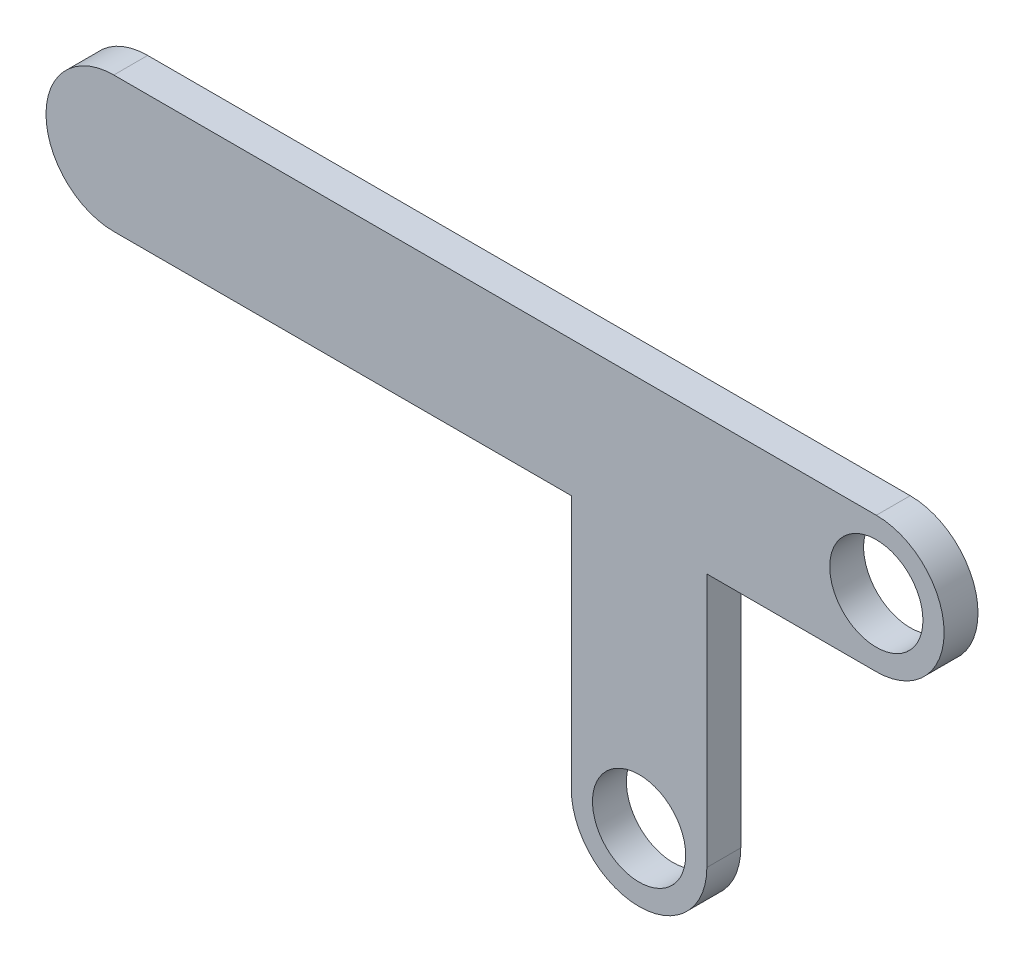
ISO-10303-21;
HEADER;
FILE_DESCRIPTION(('STEP AP214'),'2;1');
FILE_NAME('part.step','',(''),(''),'','','');
FILE_SCHEMA(('AUTOMOTIVE_DESIGN { 1 0 10303 214 1 1 1 1 }'));
ENDSEC;
DATA;
#1=APPLICATION_CONTEXT('core data for automotive mechanical design processes');
#2=APPLICATION_PROTOCOL_DEFINITION('international standard','automotive_design',2000,#1);
#3=PRODUCT_CONTEXT('',#1,'mechanical');
#4=PRODUCT('Part','Part','',(#3));
#5=PRODUCT_RELATED_PRODUCT_CATEGORY('part','',(#4));
#6=PRODUCT_DEFINITION_FORMATION('','',#4);
#7=PRODUCT_DEFINITION_CONTEXT('part definition',#1,'design');
#8=PRODUCT_DEFINITION('design','',#6,#7);
#9=PRODUCT_DEFINITION_SHAPE('','',#8);
#10=(LENGTH_UNIT() NAMED_UNIT(*) SI_UNIT(.MILLI.,.METRE.));
#11=(NAMED_UNIT(*) PLANE_ANGLE_UNIT() SI_UNIT($,.RADIAN.));
#12=(NAMED_UNIT(*) SI_UNIT($,.STERADIAN.) SOLID_ANGLE_UNIT());
#13=UNCERTAINTY_MEASURE_WITH_UNIT(LENGTH_MEASURE(1.E-05),#10,'distance_accuracy_value','');
#14=(GEOMETRIC_REPRESENTATION_CONTEXT(3) GLOBAL_UNCERTAINTY_ASSIGNED_CONTEXT((#13)) GLOBAL_UNIT_ASSIGNED_CONTEXT((#10,
#11,#12)) REPRESENTATION_CONTEXT('',''));
#15=CARTESIAN_POINT('',(0.,0.,0.));
#16=DIRECTION('',(0.,0.,1.));
#17=DIRECTION('',(1.,0.,0.));
#18=AXIS2_PLACEMENT_3D('',#15,#16,#17);
#19=CARTESIAN_POINT('',(0.,4.,2.));
#20=DIRECTION('',(0.,0.,1.));
#21=DIRECTION('',(1.,0.,0.));
#22=AXIS2_PLACEMENT_3D('',#19,#20,#21);
#23=PLANE('',#22);
#24=CARTESIAN_POINT('',(45.,4.,2.));
#25=DIRECTION('',(0.,0.,1.));
#26=DIRECTION('',(1.,0.,0.));
#27=AXIS2_PLACEMENT_3D('',#24,#25,#26);
#28=CIRCLE('',#27,2.75);
#29=CARTESIAN_POINT('',(47.75,4.,2.));
#30=VERTEX_POINT('',#29);
#31=EDGE_CURVE('E144',#30,#30,#28,.T.);
#32=ORIENTED_EDGE('',*,*,#31,.F.);
#33=EDGE_LOOP('',(#32));
#34=FACE_BOUND('',#33,.T.);
#35=CARTESIAN_POINT('',(0.,4.,2.));
#36=DIRECTION('',(0.,0.,1.));
#37=DIRECTION('',(1.,0.,0.));
#38=AXIS2_PLACEMENT_3D('',#35,#36,#37);
#39=CIRCLE('',#38,4.);
#40=CARTESIAN_POINT('',(0.,8.,2.));
#41=VERTEX_POINT('',#40);
#42=CARTESIAN_POINT('',(0.,0.,2.));
#43=VERTEX_POINT('',#42);
#44=EDGE_CURVE('E155',#41,#43,#39,.T.);
#45=ORIENTED_EDGE('',*,*,#44,.T.);
#46=DIRECTION('',(1.,0.,0.));
#47=VECTOR('',#46,1.);
#48=CARTESIAN_POINT('',(0.,0.,2.));
#49=LINE('',#48,#47);
#50=CARTESIAN_POINT('',(27.,0.,2.));
#51=VERTEX_POINT('',#50);
#52=EDGE_CURVE('E103',#43,#51,#49,.T.);
#53=ORIENTED_EDGE('',*,*,#52,.T.);
#54=DIRECTION('',(0.,-1.,0.));
#55=VECTOR('',#54,1.);
#56=CARTESIAN_POINT('',(27.,0.,2.));
#57=LINE('',#56,#55);
#58=CARTESIAN_POINT('',(27.,-15.,2.));
#59=VERTEX_POINT('',#58);
#60=EDGE_CURVE('E170',#51,#59,#57,.T.);
#61=ORIENTED_EDGE('',*,*,#60,.T.);
#62=CARTESIAN_POINT('',(31.,-15.,2.));
#63=DIRECTION('',(0.,0.,1.));
#64=DIRECTION('',(1.,0.,0.));
#65=AXIS2_PLACEMENT_3D('',#62,#63,#64);
#66=CIRCLE('',#65,3.99999999999999);
#67=CARTESIAN_POINT('',(35.,-15.,2.));
#68=VERTEX_POINT('',#67);
#69=EDGE_CURVE('E183',#59,#68,#66,.T.);
#70=ORIENTED_EDGE('',*,*,#69,.T.);
#71=DIRECTION('',(0.,1.,0.));
#72=VECTOR('',#71,1.);
#73=CARTESIAN_POINT('',(35.,0.,2.));
#74=LINE('',#73,#72);
#75=CARTESIAN_POINT('',(35.,0.,2.));
#76=VERTEX_POINT('',#75);
#77=EDGE_CURVE('E122',#68,#76,#74,.T.);
#78=ORIENTED_EDGE('',*,*,#77,.T.);
#79=DIRECTION('',(1.,0.,0.));
#80=VECTOR('',#79,1.);
#81=CARTESIAN_POINT('',(35.,0.,2.));
#82=LINE('',#81,#80);
#83=CARTESIAN_POINT('',(45.,0.,2.));
#84=VERTEX_POINT('',#83);
#85=EDGE_CURVE('E116',#76,#84,#82,.T.);
#86=ORIENTED_EDGE('',*,*,#85,.T.);
#87=CARTESIAN_POINT('',(45.,4.,2.));
#88=DIRECTION('',(0.,0.,1.));
#89=DIRECTION('',(1.,0.,0.));
#90=AXIS2_PLACEMENT_3D('',#87,#88,#89);
#91=CIRCLE('',#90,4.);
#92=CARTESIAN_POINT('',(45.,8.,2.));
#93=VERTEX_POINT('',#92);
#94=EDGE_CURVE('E120',#84,#93,#91,.T.);
#95=ORIENTED_EDGE('',*,*,#94,.T.);
#96=DIRECTION('',(-1.,0.,0.));
#97=VECTOR('',#96,1.);
#98=CARTESIAN_POINT('',(0.,8.,2.));
#99=LINE('',#98,#97);
#100=EDGE_CURVE('E60',#93,#41,#99,.T.);
#101=ORIENTED_EDGE('',*,*,#100,.T.);
#102=EDGE_LOOP('',(#45,#53,#61,#70,#78,#86,#95,#101));
#103=FACE_BOUND('',#102,.T.);
#104=CARTESIAN_POINT('',(31.,-15.,2.));
#105=DIRECTION('',(0.,0.,1.));
#106=DIRECTION('',(1.,0.,0.));
#107=AXIS2_PLACEMENT_3D('',#104,#105,#106);
#108=CIRCLE('',#107,2.74999999999999);
#109=CARTESIAN_POINT('',(33.75,-15.,2.));
#110=VERTEX_POINT('',#109);
#111=EDGE_CURVE('E192',#110,#110,#108,.T.);
#112=ORIENTED_EDGE('',*,*,#111,.F.);
#113=EDGE_LOOP('',(#112));
#114=FACE_BOUND('',#113,.T.);
#115=ADVANCED_FACE('F43',(#34,#103,#114),#23,.T.);
#116=CARTESIAN_POINT('',(0.,4.,0.));
#117=DIRECTION('',(0.,0.,1.));
#118=DIRECTION('',(1.,0.,0.));
#119=AXIS2_PLACEMENT_3D('',#116,#117,#118);
#120=PLANE('',#119);
#121=CARTESIAN_POINT('',(0.,4.,0.));
#122=DIRECTION('',(0.,0.,1.));
#123=DIRECTION('',(1.,0.,0.));
#124=AXIS2_PLACEMENT_3D('',#121,#122,#123);
#125=CIRCLE('',#124,4.);
#126=CARTESIAN_POINT('',(0.,8.,0.));
#127=VERTEX_POINT('',#126);
#128=CARTESIAN_POINT('',(0.,0.,0.));
#129=VERTEX_POINT('',#128);
#130=EDGE_CURVE('E140',#127,#129,#125,.T.);
#131=ORIENTED_EDGE('',*,*,#130,.F.);
#132=DIRECTION('',(-1.,0.,0.));
#133=VECTOR('',#132,1.);
#134=CARTESIAN_POINT('',(0.,8.,0.));
#135=LINE('',#134,#133);
#136=CARTESIAN_POINT('',(45.,8.,0.));
#137=VERTEX_POINT('',#136);
#138=EDGE_CURVE('E95',#137,#127,#135,.T.);
#139=ORIENTED_EDGE('',*,*,#138,.F.);
#140=CARTESIAN_POINT('',(45.,4.,0.));
#141=DIRECTION('',(0.,0.,1.));
#142=DIRECTION('',(1.,0.,0.));
#143=AXIS2_PLACEMENT_3D('',#140,#141,#142);
#144=CIRCLE('',#143,4.);
#145=CARTESIAN_POINT('',(45.,0.,0.));
#146=VERTEX_POINT('',#145);
#147=EDGE_CURVE('E89',#146,#137,#144,.T.);
#148=ORIENTED_EDGE('',*,*,#147,.F.);
#149=DIRECTION('',(1.,0.,0.));
#150=VECTOR('',#149,1.);
#151=CARTESIAN_POINT('',(35.,0.,0.));
#152=LINE('',#151,#150);
#153=CARTESIAN_POINT('',(35.,0.,0.));
#154=VERTEX_POINT('',#153);
#155=EDGE_CURVE('E130',#154,#146,#152,.T.);
#156=ORIENTED_EDGE('',*,*,#155,.F.);
#157=DIRECTION('',(0.,1.,0.));
#158=VECTOR('',#157,1.);
#159=CARTESIAN_POINT('',(35.,0.,0.));
#160=LINE('',#159,#158);
#161=CARTESIAN_POINT('',(35.,-15.,0.));
#162=VERTEX_POINT('',#161);
#163=EDGE_CURVE('E150',#162,#154,#160,.T.);
#164=ORIENTED_EDGE('',*,*,#163,.F.);
#165=CARTESIAN_POINT('',(31.,-15.,0.));
#166=DIRECTION('',(0.,0.,1.));
#167=DIRECTION('',(1.,0.,0.));
#168=AXIS2_PLACEMENT_3D('',#165,#166,#167);
#169=CIRCLE('',#168,3.99999999999999);
#170=CARTESIAN_POINT('',(27.,-15.,0.));
#171=VERTEX_POINT('',#170);
#172=EDGE_CURVE('E148',#171,#162,#169,.T.);
#173=ORIENTED_EDGE('',*,*,#172,.F.);
#174=DIRECTION('',(0.,-1.,0.));
#175=VECTOR('',#174,1.);
#176=CARTESIAN_POINT('',(27.,0.,0.));
#177=LINE('',#176,#175);
#178=CARTESIAN_POINT('',(27.,0.,0.));
#179=VERTEX_POINT('',#178);
#180=EDGE_CURVE('E146',#179,#171,#177,.T.);
#181=ORIENTED_EDGE('',*,*,#180,.F.);
#182=DIRECTION('',(1.,0.,0.));
#183=VECTOR('',#182,1.);
#184=CARTESIAN_POINT('',(0.,0.,0.));
#185=LINE('',#184,#183);
#186=EDGE_CURVE('E143',#129,#179,#185,.T.);
#187=ORIENTED_EDGE('',*,*,#186,.F.);
#188=EDGE_LOOP('',(#131,#139,#148,#156,#164,#173,#181,#187));
#189=FACE_BOUND('',#188,.T.);
#190=CARTESIAN_POINT('',(45.,4.,0.));
#191=DIRECTION('',(0.,0.,1.));
#192=DIRECTION('',(1.,0.,0.));
#193=AXIS2_PLACEMENT_3D('',#190,#191,#192);
#194=CIRCLE('',#193,2.75);
#195=CARTESIAN_POINT('',(47.75,4.,0.));
#196=VERTEX_POINT('',#195);
#197=EDGE_CURVE('E189',#196,#196,#194,.T.);
#198=ORIENTED_EDGE('',*,*,#197,.T.);
#199=EDGE_LOOP('',(#198));
#200=FACE_BOUND('',#199,.T.);
#201=CARTESIAN_POINT('',(31.,-15.,0.));
#202=DIRECTION('',(0.,0.,1.));
#203=DIRECTION('',(1.,0.,0.));
#204=AXIS2_PLACEMENT_3D('',#201,#202,#203);
#205=CIRCLE('',#204,2.74999999999999);
#206=CARTESIAN_POINT('',(33.75,-15.,0.));
#207=VERTEX_POINT('',#206);
#208=EDGE_CURVE('E195',#207,#207,#205,.T.);
#209=ORIENTED_EDGE('',*,*,#208,.T.);
#210=EDGE_LOOP('',(#209));
#211=FACE_BOUND('',#210,.T.);
#212=ADVANCED_FACE('F174',(#189,#200,#211),#120,.F.);
#213=CARTESIAN_POINT('',(0.,4.,2.));
#214=DIRECTION('',(0.,0.,-1.));
#215=DIRECTION('',(-1.,0.,0.));
#216=AXIS2_PLACEMENT_3D('',#213,#214,#215);
#217=CYLINDRICAL_SURFACE('',#216,4.);
#218=ORIENTED_EDGE('',*,*,#130,.T.);
#219=DIRECTION('',(0.,0.,-1.));
#220=VECTOR('',#219,1.);
#221=CARTESIAN_POINT('',(0.,0.,2.));
#222=LINE('',#221,#220);
#223=EDGE_CURVE('E11',#43,#129,#222,.T.);
#224=ORIENTED_EDGE('',*,*,#223,.F.);
#225=ORIENTED_EDGE('',*,*,#44,.F.);
#226=DIRECTION('',(0.,0.,-1.));
#227=VECTOR('',#226,1.);
#228=CARTESIAN_POINT('',(0.,8.,2.));
#229=LINE('',#228,#227);
#230=EDGE_CURVE('E136',#41,#127,#229,.T.);
#231=ORIENTED_EDGE('',*,*,#230,.T.);
#232=EDGE_LOOP('',(#218,#224,#225,#231));
#233=FACE_BOUND('',#232,.T.);
#234=ADVANCED_FACE('F45',(#233),#217,.T.);
#235=CARTESIAN_POINT('',(0.,0.,2.));
#236=DIRECTION('',(0.,1.,0.));
#237=DIRECTION('',(0.,0.,1.));
#238=AXIS2_PLACEMENT_3D('',#235,#236,#237);
#239=PLANE('',#238);
#240=ORIENTED_EDGE('',*,*,#186,.T.);
#241=DIRECTION('',(0.,0.,-1.));
#242=VECTOR('',#241,1.);
#243=CARTESIAN_POINT('',(27.,0.,2.));
#244=LINE('',#243,#242);
#245=EDGE_CURVE('E52',#51,#179,#244,.T.);
#246=ORIENTED_EDGE('',*,*,#245,.F.);
#247=ORIENTED_EDGE('',*,*,#52,.F.);
#248=ORIENTED_EDGE('',*,*,#223,.T.);
#249=EDGE_LOOP('',(#240,#246,#247,#248));
#250=FACE_BOUND('',#249,.T.);
#251=ADVANCED_FACE('F227',(#250),#239,.F.);
#252=CARTESIAN_POINT('',(27.,0.,2.));
#253=DIRECTION('',(1.,0.,0.));
#254=DIRECTION('',(0.,1.,0.));
#255=AXIS2_PLACEMENT_3D('',#252,#253,#254);
#256=PLANE('',#255);
#257=ORIENTED_EDGE('',*,*,#180,.T.);
#258=DIRECTION('',(0.,0.,-1.));
#259=VECTOR('',#258,1.);
#260=CARTESIAN_POINT('',(27.,-15.,2.));
#261=LINE('',#260,#259);
#262=EDGE_CURVE('E162',#59,#171,#261,.T.);
#263=ORIENTED_EDGE('',*,*,#262,.F.);
#264=ORIENTED_EDGE('',*,*,#60,.F.);
#265=ORIENTED_EDGE('',*,*,#245,.T.);
#266=EDGE_LOOP('',(#257,#263,#264,#265));
#267=FACE_BOUND('',#266,.T.);
#268=ADVANCED_FACE('F168',(#267),#256,.F.);
#269=CARTESIAN_POINT('',(31.,-15.,2.));
#270=DIRECTION('',(0.,0.,-1.));
#271=DIRECTION('',(-1.,0.,0.));
#272=AXIS2_PLACEMENT_3D('',#269,#270,#271);
#273=CYLINDRICAL_SURFACE('',#272,3.99999999999999);
#274=ORIENTED_EDGE('',*,*,#172,.T.);
#275=DIRECTION('',(0.,0.,-1.));
#276=VECTOR('',#275,1.);
#277=CARTESIAN_POINT('',(35.,-15.,2.));
#278=LINE('',#277,#276);
#279=EDGE_CURVE('E159',#68,#162,#278,.T.);
#280=ORIENTED_EDGE('',*,*,#279,.F.);
#281=ORIENTED_EDGE('',*,*,#69,.F.);
#282=ORIENTED_EDGE('',*,*,#262,.T.);
#283=EDGE_LOOP('',(#274,#280,#281,#282));
#284=FACE_BOUND('',#283,.T.);
#285=ADVANCED_FACE('F179',(#284),#273,.T.);
#286=CARTESIAN_POINT('',(35.,0.,2.));
#287=DIRECTION('',(-1.,0.,0.));
#288=DIRECTION('',(0.,-1.,0.));
#289=AXIS2_PLACEMENT_3D('',#286,#287,#288);
#290=PLANE('',#289);
#291=ORIENTED_EDGE('',*,*,#163,.T.);
#292=DIRECTION('',(0.,0.,-1.));
#293=VECTOR('',#292,1.);
#294=CARTESIAN_POINT('',(35.,0.,2.));
#295=LINE('',#294,#293);
#296=EDGE_CURVE('E131',#76,#154,#295,.T.);
#297=ORIENTED_EDGE('',*,*,#296,.F.);
#298=ORIENTED_EDGE('',*,*,#77,.F.);
#299=ORIENTED_EDGE('',*,*,#279,.T.);
#300=EDGE_LOOP('',(#291,#297,#298,#299));
#301=FACE_BOUND('',#300,.T.);
#302=ADVANCED_FACE('F182',(#301),#290,.F.);
#303=CARTESIAN_POINT('',(35.,0.,2.));
#304=DIRECTION('',(0.,1.,0.));
#305=DIRECTION('',(0.,0.,1.));
#306=AXIS2_PLACEMENT_3D('',#303,#304,#305);
#307=PLANE('',#306);
#308=ORIENTED_EDGE('',*,*,#155,.T.);
#309=DIRECTION('',(0.,0.,-1.));
#310=VECTOR('',#309,1.);
#311=CARTESIAN_POINT('',(45.,0.,2.));
#312=LINE('',#311,#310);
#313=EDGE_CURVE('E127',#84,#146,#312,.T.);
#314=ORIENTED_EDGE('',*,*,#313,.F.);
#315=ORIENTED_EDGE('',*,*,#85,.F.);
#316=ORIENTED_EDGE('',*,*,#296,.T.);
#317=EDGE_LOOP('',(#308,#314,#315,#316));
#318=FACE_BOUND('',#317,.T.);
#319=ADVANCED_FACE('F128',(#318),#307,.F.);
#320=CARTESIAN_POINT('',(45.,4.,2.));
#321=DIRECTION('',(0.,0.,-1.));
#322=DIRECTION('',(-1.,0.,0.));
#323=AXIS2_PLACEMENT_3D('',#320,#321,#322);
#324=CYLINDRICAL_SURFACE('',#323,4.);
#325=ORIENTED_EDGE('',*,*,#147,.T.);
#326=DIRECTION('',(0.,0.,-1.));
#327=VECTOR('',#326,1.);
#328=CARTESIAN_POINT('',(45.,8.,2.));
#329=LINE('',#328,#327);
#330=EDGE_CURVE('E132',#93,#137,#329,.T.);
#331=ORIENTED_EDGE('',*,*,#330,.F.);
#332=ORIENTED_EDGE('',*,*,#94,.F.);
#333=ORIENTED_EDGE('',*,*,#313,.T.);
#334=EDGE_LOOP('',(#325,#331,#332,#333));
#335=FACE_BOUND('',#334,.T.);
#336=ADVANCED_FACE('F134',(#335),#324,.T.);
#337=CARTESIAN_POINT('',(0.,8.,2.));
#338=DIRECTION('',(0.,-1.,0.));
#339=DIRECTION('',(0.,0.,-1.));
#340=AXIS2_PLACEMENT_3D('',#337,#338,#339);
#341=PLANE('',#340);
#342=ORIENTED_EDGE('',*,*,#138,.T.);
#343=ORIENTED_EDGE('',*,*,#230,.F.);
#344=ORIENTED_EDGE('',*,*,#100,.F.);
#345=ORIENTED_EDGE('',*,*,#330,.T.);
#346=EDGE_LOOP('',(#342,#343,#344,#345));
#347=FACE_BOUND('',#346,.T.);
#348=ADVANCED_FACE('F215',(#347),#341,.F.);
#349=CARTESIAN_POINT('',(45.,4.,2.));
#350=DIRECTION('',(0.,0.,-1.));
#351=DIRECTION('',(-1.,0.,0.));
#352=AXIS2_PLACEMENT_3D('',#349,#350,#351);
#353=CYLINDRICAL_SURFACE('',#352,2.75);
#354=ORIENTED_EDGE('',*,*,#31,.T.);
#355=EDGE_LOOP('',(#354));
#356=FACE_BOUND('',#355,.T.);
#357=ORIENTED_EDGE('',*,*,#197,.F.);
#358=EDGE_LOOP('',(#357));
#359=FACE_BOUND('',#358,.T.);
#360=ADVANCED_FACE('F212',(#356,#359),#353,.F.);
#361=CARTESIAN_POINT('',(31.,-15.,2.));
#362=DIRECTION('',(0.,0.,-1.));
#363=DIRECTION('',(-1.,0.,0.));
#364=AXIS2_PLACEMENT_3D('',#361,#362,#363);
#365=CYLINDRICAL_SURFACE('',#364,2.74999999999999);
#366=ORIENTED_EDGE('',*,*,#111,.T.);
#367=EDGE_LOOP('',(#366));
#368=FACE_BOUND('',#367,.T.);
#369=ORIENTED_EDGE('',*,*,#208,.F.);
#370=EDGE_LOOP('',(#369));
#371=FACE_BOUND('',#370,.T.);
#372=ADVANCED_FACE('F201',(#368,#371),#365,.F.);
#373=CLOSED_SHELL('',(#115,#212,#234,#251,#268,#285,#302,#319,#336,#348,#360,#372));
#374=MANIFOLD_SOLID_BREP('B2',#373);
#375=ADVANCED_BREP_SHAPE_REPRESENTATION('',(#18,#374),#14);
#376=SHAPE_DEFINITION_REPRESENTATION(#9,#375);
ENDSEC;
END-ISO-10303-21;
